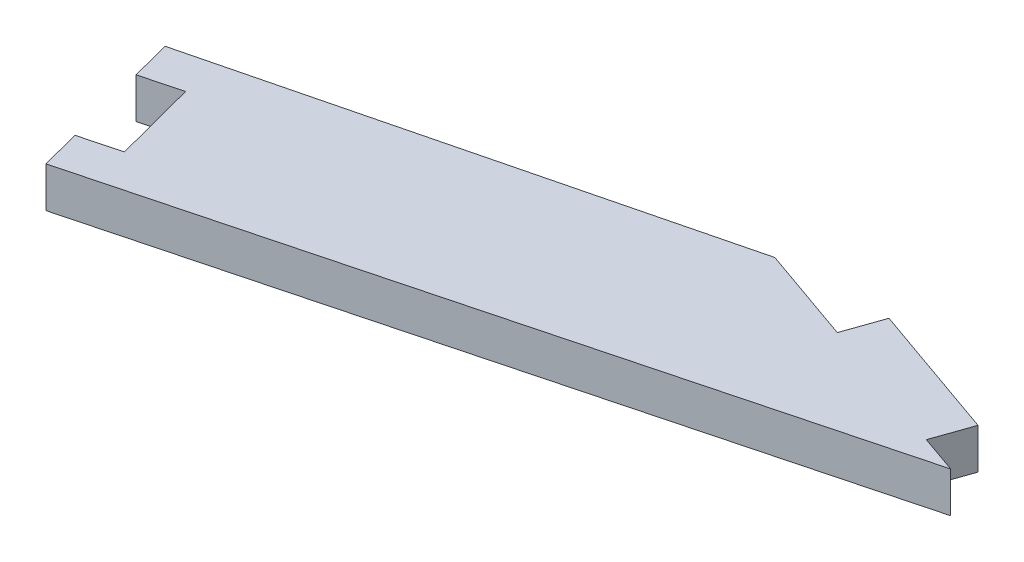
ISO-10303-21;
HEADER;
FILE_DESCRIPTION(('STEP AP214'),'2;1');
FILE_NAME('part.step','',(''),(''),'','','');
FILE_SCHEMA(('AUTOMOTIVE_DESIGN { 1 0 10303 214 1 1 1 1 }'));
ENDSEC;
DATA;
#1=APPLICATION_CONTEXT('core data for automotive mechanical design processes');
#2=APPLICATION_PROTOCOL_DEFINITION('international standard','automotive_design',2000,#1);
#3=PRODUCT_CONTEXT('',#1,'mechanical');
#4=PRODUCT('Part','Part','',(#3));
#5=PRODUCT_RELATED_PRODUCT_CATEGORY('part','',(#4));
#6=PRODUCT_DEFINITION_FORMATION('','',#4);
#7=PRODUCT_DEFINITION_CONTEXT('part definition',#1,'design');
#8=PRODUCT_DEFINITION('design','',#6,#7);
#9=PRODUCT_DEFINITION_SHAPE('','',#8);
#10=(LENGTH_UNIT() NAMED_UNIT(*) SI_UNIT(.MILLI.,.METRE.));
#11=(NAMED_UNIT(*) PLANE_ANGLE_UNIT() SI_UNIT($,.RADIAN.));
#12=(NAMED_UNIT(*) SI_UNIT($,.STERADIAN.) SOLID_ANGLE_UNIT());
#13=UNCERTAINTY_MEASURE_WITH_UNIT(LENGTH_MEASURE(1.E-05),#10,'distance_accuracy_value','');
#14=(GEOMETRIC_REPRESENTATION_CONTEXT(3) GLOBAL_UNCERTAINTY_ASSIGNED_CONTEXT((#13)) GLOBAL_UNIT_ASSIGNED_CONTEXT((#10,
#11,#12)) REPRESENTATION_CONTEXT('',''));
#15=CARTESIAN_POINT('',(0.,0.,0.));
#16=DIRECTION('',(0.,0.,1.));
#17=DIRECTION('',(1.,0.,0.));
#18=AXIS2_PLACEMENT_3D('',#15,#16,#17);
#19=CARTESIAN_POINT('',(600.,15.,39.9999999999999));
#20=DIRECTION('',(-0.253898128412102,0.,-0.967230965379434));
#21=DIRECTION('',(-0.967230965379434,0.,0.253898128412102));
#22=AXIS2_PLACEMENT_3D('',#19,#20,#21);
#23=PLANE('',#22);
#24=DIRECTION('',(0.967230965379434,0.,-0.253898128412102));
#25=VECTOR('',#24,1.);
#26=CARTESIAN_POINT('',(600.,0.,39.9999999999999));
#27=LINE('',#26,#25);
#28=CARTESIAN_POINT('',(309.276307822856,0.,116.3149691965));
#29=VERTEX_POINT('',#28);
#30=CARTESIAN_POINT('',(574.468123655738,0.,46.7021175403687));
#31=VERTEX_POINT('',#30);
#32=EDGE_CURVE('E232',#29,#31,#27,.T.);
#33=ORIENTED_EDGE('',*,*,#32,.T.);
#34=DIRECTION('',(0.,1.,0.));
#35=VECTOR('',#34,1.);
#36=CARTESIAN_POINT('',(574.468123655738,15.,46.7021175403687));
#37=LINE('',#36,#35);
#38=CARTESIAN_POINT('',(574.468123655738,15.,46.7021175403687));
#39=VERTEX_POINT('',#38);
#40=EDGE_CURVE('E189',#31,#39,#37,.T.);
#41=ORIENTED_EDGE('',*,*,#40,.T.);
#42=DIRECTION('',(0.967230965379434,0.,-0.253898128412102));
#43=VECTOR('',#42,1.);
#44=CARTESIAN_POINT('',(600.,15.,39.9999999999999));
#45=LINE('',#44,#43);
#46=CARTESIAN_POINT('',(309.276307822856,15.,116.3149691965));
#47=VERTEX_POINT('',#46);
#48=EDGE_CURVE('E102',#47,#39,#45,.T.);
#49=ORIENTED_EDGE('',*,*,#48,.F.);
#50=DIRECTION('',(0.,-1.,0.));
#51=VECTOR('',#50,1.);
#52=CARTESIAN_POINT('',(309.276307822856,15.,116.3149691965));
#53=LINE('',#52,#51);
#54=EDGE_CURVE('E219',#47,#29,#53,.T.);
#55=ORIENTED_EDGE('',*,*,#54,.T.);
#56=EDGE_LOOP('',(#33,#41,#49,#55));
#57=FACE_BOUND('',#56,.T.);
#58=ADVANCED_FACE('F94',(#57),#23,.F.);
#59=CARTESIAN_POINT('',(-99.9999999999999,-40.,155.));
#60=DIRECTION('',(0.242535625036333,0.,0.970142500145332));
#61=DIRECTION('',(0.970142500145332,0.,-0.242535625036333));
#62=AXIS2_PLACEMENT_3D('',#59,#60,#61);
#63=PLANE('',#62);
#64=DIRECTION('',(0.970142500145332,0.,-0.242535625036333));
#65=VECTOR('',#64,1.);
#66=CARTESIAN_POINT('',(-99.9999999999999,15.,155.));
#67=LINE('',#66,#65);
#68=CARTESIAN_POINT('',(293.601058917325,15.,56.5997352706688));
#69=VERTEX_POINT('',#68);
#70=CARTESIAN_POINT('',(474.157502729817,15.,11.4606243175458));
#71=VERTEX_POINT('',#70);
#72=EDGE_CURVE('E12',#69,#71,#67,.T.);
#73=ORIENTED_EDGE('',*,*,#72,.T.);
#74=DIRECTION('',(0.,-1.,0.));
#75=VECTOR('',#74,1.);
#76=CARTESIAN_POINT('',(474.157502729817,15.,11.4606243175458));
#77=LINE('',#76,#75);
#78=CARTESIAN_POINT('',(474.157502729817,0.,11.4606243175458));
#79=VERTEX_POINT('',#78);
#80=EDGE_CURVE('E181',#71,#79,#77,.T.);
#81=ORIENTED_EDGE('',*,*,#80,.T.);
#82=DIRECTION('',(0.970142500145332,0.,-0.242535625036333));
#83=VECTOR('',#82,1.);
#84=CARTESIAN_POINT('',(30.5882352941176,0.,122.352941176471));
#85=LINE('',#84,#83);
#86=CARTESIAN_POINT('',(293.601058917325,0.,56.5997352706687));
#87=VERTEX_POINT('',#86);
#88=EDGE_CURVE('E200',#87,#79,#85,.T.);
#89=ORIENTED_EDGE('',*,*,#88,.F.);
#90=DIRECTION('',(0.,-1.,0.));
#91=VECTOR('',#90,1.);
#92=CARTESIAN_POINT('',(293.601058917325,15.,56.5997352706687));
#93=LINE('',#92,#91);
#94=EDGE_CURVE('E199',#69,#87,#93,.T.);
#95=ORIENTED_EDGE('',*,*,#94,.F.);
#96=EDGE_LOOP('',(#73,#81,#89,#95));
#97=FACE_BOUND('',#96,.T.);
#98=ADVANCED_FACE('F96',(#97),#63,.F.);
#99=CARTESIAN_POINT('',(0.,0.,0.));
#100=DIRECTION('',(0.,1.,0.));
#101=DIRECTION('',(0.,0.,1.));
#102=AXIS2_PLACEMENT_3D('',#99,#100,#101);
#103=PLANE('',#102);
#104=ORIENTED_EDGE('',*,*,#88,.T.);
#105=DIRECTION('',(-0.943468313781704,0.,-0.331462729262143));
#106=VECTOR('',#105,1.);
#107=CARTESIAN_POINT('',(48.5104998672998,0.,-138.079233259171));
#108=LINE('',#107,#106);
#109=CARTESIAN_POINT('',(509.777233764887,0.,23.9746781463843));
#110=VERTEX_POINT('',#109);
#111=EDGE_CURVE('E109',#110,#79,#108,.T.);
#112=ORIENTED_EDGE('',*,*,#111,.F.);
#113=DIRECTION('',(0.331462729262137,0.,-0.943468313781706));
#114=VECTOR('',#113,1.);
#115=CARTESIAN_POINT('',(461.266733897589,0.,162.053911405553));
#116=LINE('',#115,#114);
#117=CARTESIAN_POINT('',(514.749174703819,0.,9.82265343965885));
#118=VERTEX_POINT('',#117);
#119=EDGE_CURVE('E260',#110,#118,#116,.T.);
#120=ORIENTED_EDGE('',*,*,#119,.T.);
#121=DIRECTION('',(-0.943468313781704,0.,-0.331462729262143));
#122=VECTOR('',#121,1.);
#123=CARTESIAN_POINT('',(53.482440806232,0.,-152.231257965897));
#124=LINE('',#123,#122);
#125=CARTESIAN_POINT('',(565.538165046119,0.,27.6660267776028));
#126=VERTEX_POINT('',#125);
#127=EDGE_CURVE('E255',#126,#118,#124,.T.);
#128=ORIENTED_EDGE('',*,*,#127,.F.);
#129=DIRECTION('',(0.331462729262145,0.,-0.943468313781703));
#130=VECTOR('',#129,1.);
#131=CARTESIAN_POINT('',(512.055724239886,0.,179.8972847435));
#132=LINE('',#131,#130);
#133=CARTESIAN_POINT('',(560.566224107187,0.,41.8180514843282));
#134=VERTEX_POINT('',#133);
#135=EDGE_CURVE('E250',#134,#126,#132,.T.);
#136=ORIENTED_EDGE('',*,*,#135,.F.);
#137=DIRECTION('',(-0.943468313781704,0.,-0.331462729262143));
#138=VECTOR('',#137,1.);
#139=CARTESIAN_POINT('',(48.5104998672998,0.,-138.079233259171));
#140=LINE('',#139,#138);
#141=EDGE_CURVE('E247',#31,#134,#140,.T.);
#142=ORIENTED_EDGE('',*,*,#141,.F.);
#143=ORIENTED_EDGE('',*,*,#32,.F.);
#144=DIRECTION('',(-0.253898128412102,0.,-0.967230965379434));
#145=VECTOR('',#144,1.);
#146=CARTESIAN_POINT('',(260.774626782072,0.,-68.4533395302942));
#147=LINE('',#146,#145);
#148=CARTESIAN_POINT('',(305.467835896674,0.,101.806504715809));
#149=VERTEX_POINT('',#148);
#150=EDGE_CURVE('E241',#29,#149,#147,.T.);
#151=ORIENTED_EDGE('',*,*,#150,.T.);
#152=DIRECTION('',(0.967230965379434,0.,-0.253898128412101));
#153=VECTOR('',#152,1.);
#154=CARTESIAN_POINT('',(44.6932091146019,0.,170.259844246103));
#155=LINE('',#154,#153);
#156=CARTESIAN_POINT('',(319.976300377366,0.,97.9980327896271));
#157=VERTEX_POINT('',#156);
#158=EDGE_CURVE('E246',#149,#157,#155,.T.);
#159=ORIENTED_EDGE('',*,*,#158,.T.);
#160=DIRECTION('',(0.253898128412102,0.,0.967230965379434));
#161=VECTOR('',#160,1.);
#162=CARTESIAN_POINT('',(275.283091262764,0.,-72.2618114564757));
#163=LINE('',#162,#161);
#164=CARTESIAN_POINT('',(311.917995324198,0.,67.2997278251788));
#165=VERTEX_POINT('',#164);
#166=EDGE_CURVE('E242',#165,#157,#163,.T.);
#167=ORIENTED_EDGE('',*,*,#166,.F.);
#168=DIRECTION('',(0.967230965379435,0.,-0.2538981284121));
#169=VECTOR('',#168,1.);
#170=CARTESIAN_POINT('',(36.6349040614339,0.,139.561539281654));
#171=LINE('',#170,#169);
#172=CARTESIAN_POINT('',(297.409530843507,0.,71.1081997513604));
#173=VERTEX_POINT('',#172);
#174=EDGE_CURVE('E211',#173,#165,#171,.T.);
#175=ORIENTED_EDGE('',*,*,#174,.F.);
#176=EDGE_CURVE('E197',#173,#87,#147,.T.);
#177=ORIENTED_EDGE('',*,*,#176,.T.);
#178=EDGE_LOOP('',(#104,#112,#120,#128,#136,#142,#143,#151,#159,#167,#175,#177));
#179=FACE_BOUND('',#178,.T.);
#180=ADVANCED_FACE('F235',(#179),#103,.F.);
#181=CARTESIAN_POINT('',(0.,15.,0.));
#182=DIRECTION('',(0.,1.,0.));
#183=DIRECTION('',(0.,0.,1.));
#184=AXIS2_PLACEMENT_3D('',#181,#182,#183);
#185=PLANE('',#184);
#186=DIRECTION('',(-0.943468313781704,0.,-0.331462729262143));
#187=VECTOR('',#186,1.);
#188=CARTESIAN_POINT('',(48.5104998672998,15.,-138.079233259171));
#189=LINE('',#188,#187);
#190=CARTESIAN_POINT('',(509.777233764887,15.,23.9746781463843));
#191=VERTEX_POINT('',#190);
#192=EDGE_CURVE('E184',#191,#71,#189,.T.);
#193=ORIENTED_EDGE('',*,*,#192,.T.);
#194=ORIENTED_EDGE('',*,*,#72,.F.);
#195=DIRECTION('',(-0.253898128412102,0.,-0.967230965379434));
#196=VECTOR('',#195,1.);
#197=CARTESIAN_POINT('',(260.774626782072,15.,-68.4533395302942));
#198=LINE('',#197,#196);
#199=CARTESIAN_POINT('',(297.409530843507,15.,71.1081997513604));
#200=VERTEX_POINT('',#199);
#201=EDGE_CURVE('E117',#200,#69,#198,.T.);
#202=ORIENTED_EDGE('',*,*,#201,.F.);
#203=DIRECTION('',(0.967230965379435,0.,-0.2538981284121));
#204=VECTOR('',#203,1.);
#205=CARTESIAN_POINT('',(36.6349040614339,15.,139.561539281654));
#206=LINE('',#205,#204);
#207=CARTESIAN_POINT('',(311.917995324198,15.,67.2997278251788));
#208=VERTEX_POINT('',#207);
#209=EDGE_CURVE('E207',#200,#208,#206,.T.);
#210=ORIENTED_EDGE('',*,*,#209,.T.);
#211=DIRECTION('',(0.253898128412102,0.,0.967230965379434));
#212=VECTOR('',#211,1.);
#213=CARTESIAN_POINT('',(275.283091262764,15.,-72.2618114564757));
#214=LINE('',#213,#212);
#215=CARTESIAN_POINT('',(319.976300377366,15.,97.9980327896271));
#216=VERTEX_POINT('',#215);
#217=EDGE_CURVE('E265',#208,#216,#214,.T.);
#218=ORIENTED_EDGE('',*,*,#217,.T.);
#219=DIRECTION('',(0.967230965379434,0.,-0.253898128412101));
#220=VECTOR('',#219,1.);
#221=CARTESIAN_POINT('',(44.6932091146019,15.,170.259844246103));
#222=LINE('',#221,#220);
#223=CARTESIAN_POINT('',(305.467835896674,15.,101.806504715809));
#224=VERTEX_POINT('',#223);
#225=EDGE_CURVE('E268',#224,#216,#222,.T.);
#226=ORIENTED_EDGE('',*,*,#225,.F.);
#227=EDGE_CURVE('E209',#47,#224,#198,.T.);
#228=ORIENTED_EDGE('',*,*,#227,.F.);
#229=ORIENTED_EDGE('',*,*,#48,.T.);
#230=DIRECTION('',(-0.943468313781704,0.,-0.331462729262143));
#231=VECTOR('',#230,1.);
#232=CARTESIAN_POINT('',(48.5104998672998,15.,-138.079233259171));
#233=LINE('',#232,#231);
#234=CARTESIAN_POINT('',(560.566224107187,15.,41.8180514843282));
#235=VERTEX_POINT('',#234);
#236=EDGE_CURVE('E270',#39,#235,#233,.T.);
#237=ORIENTED_EDGE('',*,*,#236,.T.);
#238=DIRECTION('',(0.331462729262145,0.,-0.943468313781703));
#239=VECTOR('',#238,1.);
#240=CARTESIAN_POINT('',(512.055724239886,15.,179.8972847435));
#241=LINE('',#240,#239);
#242=CARTESIAN_POINT('',(565.538165046119,15.,27.6660267776028));
#243=VERTEX_POINT('',#242);
#244=EDGE_CURVE('E273',#235,#243,#241,.T.);
#245=ORIENTED_EDGE('',*,*,#244,.T.);
#246=DIRECTION('',(-0.943468313781704,0.,-0.331462729262143));
#247=VECTOR('',#246,1.);
#248=CARTESIAN_POINT('',(53.482440806232,15.,-152.231257965897));
#249=LINE('',#248,#247);
#250=CARTESIAN_POINT('',(514.749174703819,15.,9.82265343965885));
#251=VERTEX_POINT('',#250);
#252=EDGE_CURVE('E276',#243,#251,#249,.T.);
#253=ORIENTED_EDGE('',*,*,#252,.T.);
#254=DIRECTION('',(0.331462729262137,0.,-0.943468313781706));
#255=VECTOR('',#254,1.);
#256=CARTESIAN_POINT('',(461.266733897589,15.,162.053911405553));
#257=LINE('',#256,#255);
#258=EDGE_CURVE('E196',#191,#251,#257,.T.);
#259=ORIENTED_EDGE('',*,*,#258,.F.);
#260=EDGE_LOOP('',(#193,#194,#202,#210,#218,#226,#228,#229,#237,#245,#253,#259));
#261=FACE_BOUND('',#260,.T.);
#262=ADVANCED_FACE('F194',(#261),#185,.T.);
#263=CARTESIAN_POINT('',(260.774626782072,15.,-68.4533395302942));
#264=DIRECTION('',(-0.967230965379434,0.,0.253898128412102));
#265=DIRECTION('',(0.253898128412102,0.,0.967230965379434));
#266=AXIS2_PLACEMENT_3D('',#263,#264,#265);
#267=PLANE('',#266);
#268=ORIENTED_EDGE('',*,*,#176,.F.);
#269=DIRECTION('',(0.,-1.,0.));
#270=VECTOR('',#269,1.);
#271=CARTESIAN_POINT('',(297.409530843507,15.,71.1081997513604));
#272=LINE('',#271,#270);
#273=EDGE_CURVE('E203',#200,#173,#272,.T.);
#274=ORIENTED_EDGE('',*,*,#273,.F.);
#275=ORIENTED_EDGE('',*,*,#201,.T.);
#276=ORIENTED_EDGE('',*,*,#94,.T.);
#277=EDGE_LOOP('',(#268,#274,#275,#276));
#278=FACE_BOUND('',#277,.T.);
#279=ADVANCED_FACE('F305',(#278),#267,.T.);
#280=CARTESIAN_POINT('',(36.6349040614339,15.,139.561539281654));
#281=DIRECTION('',(-0.2538981284121,0.,-0.967230965379435));
#282=DIRECTION('',(-0.967230965379435,0.,0.2538981284121));
#283=AXIS2_PLACEMENT_3D('',#280,#281,#282);
#284=PLANE('',#283);
#285=ORIENTED_EDGE('',*,*,#174,.T.);
#286=DIRECTION('',(0.,-1.,0.));
#287=VECTOR('',#286,1.);
#288=CARTESIAN_POINT('',(311.917995324198,15.,67.2997278251788));
#289=LINE('',#288,#287);
#290=EDGE_CURVE('E205',#208,#165,#289,.T.);
#291=ORIENTED_EDGE('',*,*,#290,.F.);
#292=ORIENTED_EDGE('',*,*,#209,.F.);
#293=ORIENTED_EDGE('',*,*,#273,.T.);
#294=EDGE_LOOP('',(#285,#291,#292,#293));
#295=FACE_BOUND('',#294,.T.);
#296=ADVANCED_FACE('F320',(#295),#284,.F.);
#297=CARTESIAN_POINT('',(275.283091262764,15.,-72.2618114564757));
#298=DIRECTION('',(0.967230965379434,0.,-0.253898128412102));
#299=DIRECTION('',(-0.253898128412102,0.,-0.967230965379434));
#300=AXIS2_PLACEMENT_3D('',#297,#298,#299);
#301=PLANE('',#300);
#302=ORIENTED_EDGE('',*,*,#166,.T.);
#303=DIRECTION('',(0.,-1.,0.));
#304=VECTOR('',#303,1.);
#305=CARTESIAN_POINT('',(319.976300377366,15.,97.9980327896271));
#306=LINE('',#305,#304);
#307=EDGE_CURVE('E215',#216,#157,#306,.T.);
#308=ORIENTED_EDGE('',*,*,#307,.F.);
#309=ORIENTED_EDGE('',*,*,#217,.F.);
#310=ORIENTED_EDGE('',*,*,#290,.T.);
#311=EDGE_LOOP('',(#302,#308,#309,#310));
#312=FACE_BOUND('',#311,.T.);
#313=ADVANCED_FACE('F324',(#312),#301,.F.);
#314=CARTESIAN_POINT('',(44.6932091146019,15.,170.259844246103));
#315=DIRECTION('',(-0.253898128412101,0.,-0.967230965379434));
#316=DIRECTION('',(-0.967230965379434,0.,0.253898128412101));
#317=AXIS2_PLACEMENT_3D('',#314,#315,#316);
#318=PLANE('',#317);
#319=ORIENTED_EDGE('',*,*,#158,.F.);
#320=DIRECTION('',(0.,-1.,0.));
#321=VECTOR('',#320,1.);
#322=CARTESIAN_POINT('',(305.467835896674,15.,101.806504715809));
#323=LINE('',#322,#321);
#324=EDGE_CURVE('E217',#224,#149,#323,.T.);
#325=ORIENTED_EDGE('',*,*,#324,.F.);
#326=ORIENTED_EDGE('',*,*,#225,.T.);
#327=ORIENTED_EDGE('',*,*,#307,.T.);
#328=EDGE_LOOP('',(#319,#325,#326,#327));
#329=FACE_BOUND('',#328,.T.);
#330=ADVANCED_FACE('F302',(#329),#318,.T.);
#331=ORIENTED_EDGE('',*,*,#150,.F.);
#332=ORIENTED_EDGE('',*,*,#54,.F.);
#333=ORIENTED_EDGE('',*,*,#227,.T.);
#334=ORIENTED_EDGE('',*,*,#324,.T.);
#335=EDGE_LOOP('',(#331,#332,#333,#334));
#336=FACE_BOUND('',#335,.T.);
#337=ADVANCED_FACE('F295',(#336),#267,.T.);
#338=CARTESIAN_POINT('',(48.5104998672998,15.,-138.079233259171));
#339=DIRECTION('',(-0.331462729262143,0.,0.943468313781704));
#340=DIRECTION('',(0.943468313781704,0.,0.331462729262143));
#341=AXIS2_PLACEMENT_3D('',#338,#339,#340);
#342=PLANE('',#341);
#343=ORIENTED_EDGE('',*,*,#141,.T.);
#344=DIRECTION('',(0.,-1.,0.));
#345=VECTOR('',#344,1.);
#346=CARTESIAN_POINT('',(560.566224107187,15.,41.8180514843282));
#347=LINE('',#346,#345);
#348=EDGE_CURVE('E222',#235,#134,#347,.T.);
#349=ORIENTED_EDGE('',*,*,#348,.F.);
#350=ORIENTED_EDGE('',*,*,#236,.F.);
#351=ORIENTED_EDGE('',*,*,#40,.F.);
#352=EDGE_LOOP('',(#343,#349,#350,#351));
#353=FACE_BOUND('',#352,.T.);
#354=ADVANCED_FACE('F293',(#353),#342,.F.);
#355=CARTESIAN_POINT('',(48.5104998672998,15.,-138.079233259171));
#356=DIRECTION('',(-0.331462729262143,0.,0.943468313781704));
#357=DIRECTION('',(0.943468313781704,0.,0.331462729262143));
#358=AXIS2_PLACEMENT_3D('',#355,#356,#357);
#359=PLANE('',#358);
#360=ORIENTED_EDGE('',*,*,#111,.T.);
#361=ORIENTED_EDGE('',*,*,#80,.F.);
#362=ORIENTED_EDGE('',*,*,#192,.F.);
#363=DIRECTION('',(0.,-1.,0.));
#364=VECTOR('',#363,1.);
#365=CARTESIAN_POINT('',(509.777233764887,15.,23.9746781463843));
#366=LINE('',#365,#364);
#367=EDGE_CURVE('E190',#191,#110,#366,.T.);
#368=ORIENTED_EDGE('',*,*,#367,.T.);
#369=EDGE_LOOP('',(#360,#361,#362,#368));
#370=FACE_BOUND('',#369,.T.);
#371=ADVANCED_FACE('F183',(#370),#359,.F.);
#372=CARTESIAN_POINT('',(461.266733897589,15.,162.053911405553));
#373=DIRECTION('',(-0.943468313781706,0.,-0.331462729262137));
#374=DIRECTION('',(-0.331462729262137,0.,0.943468313781706));
#375=AXIS2_PLACEMENT_3D('',#372,#373,#374);
#376=PLANE('',#375);
#377=ORIENTED_EDGE('',*,*,#119,.F.);
#378=ORIENTED_EDGE('',*,*,#367,.F.);
#379=ORIENTED_EDGE('',*,*,#258,.T.);
#380=DIRECTION('',(0.,-1.,0.));
#381=VECTOR('',#380,1.);
#382=CARTESIAN_POINT('',(514.749174703819,15.,9.82265343965885));
#383=LINE('',#382,#381);
#384=EDGE_CURVE('E227',#251,#118,#383,.T.);
#385=ORIENTED_EDGE('',*,*,#384,.T.);
#386=EDGE_LOOP('',(#377,#378,#379,#385));
#387=FACE_BOUND('',#386,.T.);
#388=ADVANCED_FACE('F281',(#387),#376,.T.);
#389=CARTESIAN_POINT('',(53.482440806232,15.,-152.231257965897));
#390=DIRECTION('',(-0.331462729262143,0.,0.943468313781704));
#391=DIRECTION('',(0.943468313781704,0.,0.331462729262143));
#392=AXIS2_PLACEMENT_3D('',#389,#390,#391);
#393=PLANE('',#392);
#394=ORIENTED_EDGE('',*,*,#127,.T.);
#395=ORIENTED_EDGE('',*,*,#384,.F.);
#396=ORIENTED_EDGE('',*,*,#252,.F.);
#397=DIRECTION('',(0.,-1.,0.));
#398=VECTOR('',#397,1.);
#399=CARTESIAN_POINT('',(565.538165046119,15.,27.6660267776028));
#400=LINE('',#399,#398);
#401=EDGE_CURVE('E225',#243,#126,#400,.T.);
#402=ORIENTED_EDGE('',*,*,#401,.T.);
#403=EDGE_LOOP('',(#394,#395,#396,#402));
#404=FACE_BOUND('',#403,.T.);
#405=ADVANCED_FACE('F284',(#404),#393,.F.);
#406=CARTESIAN_POINT('',(512.055724239886,15.,179.8972847435));
#407=DIRECTION('',(-0.943468313781703,0.,-0.331462729262145));
#408=DIRECTION('',(-0.331462729262145,0.,0.943468313781703));
#409=AXIS2_PLACEMENT_3D('',#406,#407,#408);
#410=PLANE('',#409);
#411=ORIENTED_EDGE('',*,*,#135,.T.);
#412=ORIENTED_EDGE('',*,*,#401,.F.);
#413=ORIENTED_EDGE('',*,*,#244,.F.);
#414=ORIENTED_EDGE('',*,*,#348,.T.);
#415=EDGE_LOOP('',(#411,#412,#413,#414));
#416=FACE_BOUND('',#415,.T.);
#417=ADVANCED_FACE('F289',(#416),#410,.F.);
#418=CLOSED_SHELL('',(#58,#98,#180,#262,#279,#296,#313,#330,#337,#354,#371,#388,#405,#417));
#419=MANIFOLD_SOLID_BREP('B2',#418);
#420=ADVANCED_BREP_SHAPE_REPRESENTATION('',(#18,#419),#14);
#421=SHAPE_DEFINITION_REPRESENTATION(#9,#420);
ENDSEC;
END-ISO-10303-21;
